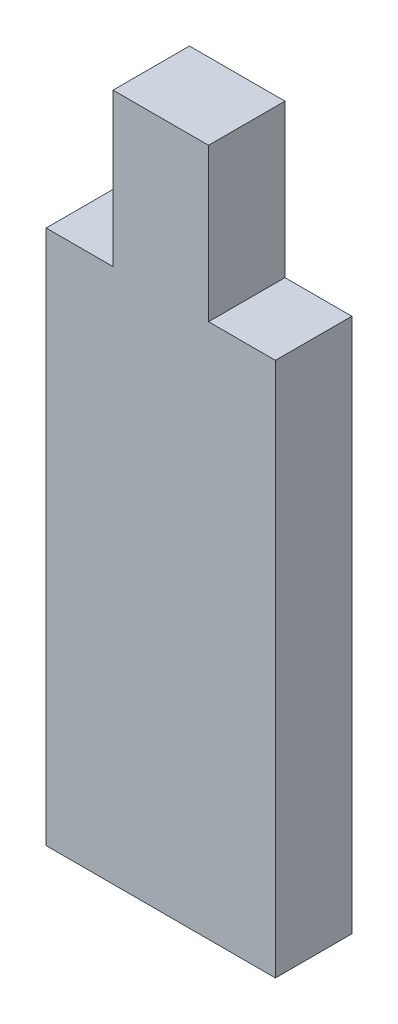
ISO-10303-21;
HEADER;
FILE_DESCRIPTION(('STEP AP214'),'2;1');
FILE_NAME('part.step','',(''),(''),'','','');
FILE_SCHEMA(('AUTOMOTIVE_DESIGN { 1 0 10303 214 1 1 1 1 }'));
ENDSEC;
DATA;
#1=APPLICATION_CONTEXT('core data for automotive mechanical design processes');
#2=APPLICATION_PROTOCOL_DEFINITION('international standard','automotive_design',2000,#1);
#3=PRODUCT_CONTEXT('',#1,'mechanical');
#4=PRODUCT('Part','Part','',(#3));
#5=PRODUCT_RELATED_PRODUCT_CATEGORY('part','',(#4));
#6=PRODUCT_DEFINITION_FORMATION('','',#4);
#7=PRODUCT_DEFINITION_CONTEXT('part definition',#1,'design');
#8=PRODUCT_DEFINITION('design','',#6,#7);
#9=PRODUCT_DEFINITION_SHAPE('','',#8);
#10=(LENGTH_UNIT() NAMED_UNIT(*) SI_UNIT(.MILLI.,.METRE.));
#11=(NAMED_UNIT(*) PLANE_ANGLE_UNIT() SI_UNIT($,.RADIAN.));
#12=(NAMED_UNIT(*) SI_UNIT($,.STERADIAN.) SOLID_ANGLE_UNIT());
#13=UNCERTAINTY_MEASURE_WITH_UNIT(LENGTH_MEASURE(1.E-05),#10,'distance_accuracy_value','');
#14=(GEOMETRIC_REPRESENTATION_CONTEXT(3) GLOBAL_UNCERTAINTY_ASSIGNED_CONTEXT((#13)) GLOBAL_UNIT_ASSIGNED_CONTEXT((#10,
#11,#12)) REPRESENTATION_CONTEXT('',''));
#15=CARTESIAN_POINT('',(0.,0.,0.));
#16=DIRECTION('',(0.,0.,1.));
#17=DIRECTION('',(1.,0.,0.));
#18=AXIS2_PLACEMENT_3D('',#15,#16,#17);
#19=CARTESIAN_POINT('',(12.,0.,4.));
#20=DIRECTION('',(0.,1.,0.));
#21=DIRECTION('',(0.,0.,1.));
#22=AXIS2_PLACEMENT_3D('',#19,#20,#21);
#23=PLANE('',#22);
#24=DIRECTION('',(1.,0.,0.));
#25=VECTOR('',#24,1.);
#26=CARTESIAN_POINT('',(12.,0.,0.));
#27=LINE('',#26,#25);
#28=CARTESIAN_POINT('',(0.,0.,0.));
#29=VERTEX_POINT('',#28);
#30=CARTESIAN_POINT('',(12.,0.,0.));
#31=VERTEX_POINT('',#30);
#32=EDGE_CURVE('E131',#29,#31,#27,.T.);
#33=ORIENTED_EDGE('',*,*,#32,.T.);
#34=DIRECTION('',(0.,0.,-1.));
#35=VECTOR('',#34,1.);
#36=CARTESIAN_POINT('',(12.,0.,4.));
#37=LINE('',#36,#35);
#38=CARTESIAN_POINT('',(12.,0.,4.));
#39=VERTEX_POINT('',#38);
#40=EDGE_CURVE('E11',#39,#31,#37,.T.);
#41=ORIENTED_EDGE('',*,*,#40,.F.);
#42=DIRECTION('',(1.,0.,0.));
#43=VECTOR('',#42,1.);
#44=CARTESIAN_POINT('',(12.,0.,4.));
#45=LINE('',#44,#43);
#46=CARTESIAN_POINT('',(0.,0.,4.));
#47=VERTEX_POINT('',#46);
#48=EDGE_CURVE('E145',#47,#39,#45,.T.);
#49=ORIENTED_EDGE('',*,*,#48,.F.);
#50=DIRECTION('',(0.,0.,-1.));
#51=VECTOR('',#50,1.);
#52=CARTESIAN_POINT('',(0.,0.,4.));
#53=LINE('',#52,#51);
#54=EDGE_CURVE('E127',#47,#29,#53,.T.);
#55=ORIENTED_EDGE('',*,*,#54,.T.);
#56=EDGE_LOOP('',(#33,#41,#49,#55));
#57=FACE_BOUND('',#56,.T.);
#58=ADVANCED_FACE('F35',(#57),#23,.F.);
#59=CARTESIAN_POINT('',(12.,28.,4.));
#60=DIRECTION('',(-1.,0.,0.));
#61=DIRECTION('',(0.,-1.,0.));
#62=AXIS2_PLACEMENT_3D('',#59,#60,#61);
#63=PLANE('',#62);
#64=DIRECTION('',(0.,1.,0.));
#65=VECTOR('',#64,1.);
#66=CARTESIAN_POINT('',(12.,28.,0.));
#67=LINE('',#66,#65);
#68=CARTESIAN_POINT('',(12.,28.,0.));
#69=VERTEX_POINT('',#68);
#70=EDGE_CURVE('E134',#31,#69,#67,.T.);
#71=ORIENTED_EDGE('',*,*,#70,.T.);
#72=DIRECTION('',(0.,0.,-1.));
#73=VECTOR('',#72,1.);
#74=CARTESIAN_POINT('',(12.,28.,4.));
#75=LINE('',#74,#73);
#76=CARTESIAN_POINT('',(12.,28.,4.));
#77=VERTEX_POINT('',#76);
#78=EDGE_CURVE('E43',#77,#69,#75,.T.);
#79=ORIENTED_EDGE('',*,*,#78,.F.);
#80=DIRECTION('',(0.,1.,0.));
#81=VECTOR('',#80,1.);
#82=CARTESIAN_POINT('',(12.,28.,4.));
#83=LINE('',#82,#81);
#84=EDGE_CURVE('E94',#39,#77,#83,.T.);
#85=ORIENTED_EDGE('',*,*,#84,.F.);
#86=ORIENTED_EDGE('',*,*,#40,.T.);
#87=EDGE_LOOP('',(#71,#79,#85,#86));
#88=FACE_BOUND('',#87,.T.);
#89=ADVANCED_FACE('F180',(#88),#63,.F.);
#90=CARTESIAN_POINT('',(8.5,28.,4.));
#91=DIRECTION('',(0.,-1.,0.));
#92=DIRECTION('',(0.,0.,-1.));
#93=AXIS2_PLACEMENT_3D('',#90,#91,#92);
#94=PLANE('',#93);
#95=DIRECTION('',(-1.,0.,0.));
#96=VECTOR('',#95,1.);
#97=CARTESIAN_POINT('',(8.5,28.,0.));
#98=LINE('',#97,#96);
#99=CARTESIAN_POINT('',(8.5,28.,0.));
#100=VERTEX_POINT('',#99);
#101=EDGE_CURVE('E136',#69,#100,#98,.T.);
#102=ORIENTED_EDGE('',*,*,#101,.T.);
#103=DIRECTION('',(0.,0.,-1.));
#104=VECTOR('',#103,1.);
#105=CARTESIAN_POINT('',(8.5,28.,4.));
#106=LINE('',#105,#104);
#107=CARTESIAN_POINT('',(8.5,28.,4.));
#108=VERTEX_POINT('',#107);
#109=EDGE_CURVE('E152',#108,#100,#106,.T.);
#110=ORIENTED_EDGE('',*,*,#109,.F.);
#111=DIRECTION('',(-1.,0.,0.));
#112=VECTOR('',#111,1.);
#113=CARTESIAN_POINT('',(8.5,28.,4.));
#114=LINE('',#113,#112);
#115=EDGE_CURVE('E160',#77,#108,#114,.T.);
#116=ORIENTED_EDGE('',*,*,#115,.F.);
#117=ORIENTED_EDGE('',*,*,#78,.T.);
#118=EDGE_LOOP('',(#102,#110,#116,#117));
#119=FACE_BOUND('',#118,.T.);
#120=ADVANCED_FACE('F158',(#119),#94,.F.);
#121=CARTESIAN_POINT('',(8.5,36.,4.));
#122=DIRECTION('',(-1.,0.,0.));
#123=DIRECTION('',(0.,0.,1.));
#124=AXIS2_PLACEMENT_3D('',#121,#122,#123);
#125=PLANE('',#124);
#126=DIRECTION('',(0.,1.,0.));
#127=VECTOR('',#126,1.);
#128=CARTESIAN_POINT('',(8.5,36.,0.));
#129=LINE('',#128,#127);
#130=CARTESIAN_POINT('',(8.5,36.,0.));
#131=VERTEX_POINT('',#130);
#132=EDGE_CURVE('E138',#100,#131,#129,.T.);
#133=ORIENTED_EDGE('',*,*,#132,.T.);
#134=DIRECTION('',(0.,0.,-1.));
#135=VECTOR('',#134,1.);
#136=CARTESIAN_POINT('',(8.5,36.,4.));
#137=LINE('',#136,#135);
#138=CARTESIAN_POINT('',(8.5,36.,4.));
#139=VERTEX_POINT('',#138);
#140=EDGE_CURVE('E149',#139,#131,#137,.T.);
#141=ORIENTED_EDGE('',*,*,#140,.F.);
#142=DIRECTION('',(0.,1.,0.));
#143=VECTOR('',#142,1.);
#144=CARTESIAN_POINT('',(8.5,36.,4.));
#145=LINE('',#144,#143);
#146=EDGE_CURVE('E172',#108,#139,#145,.T.);
#147=ORIENTED_EDGE('',*,*,#146,.F.);
#148=ORIENTED_EDGE('',*,*,#109,.T.);
#149=EDGE_LOOP('',(#133,#141,#147,#148));
#150=FACE_BOUND('',#149,.T.);
#151=ADVANCED_FACE('F168',(#150),#125,.F.);
#152=CARTESIAN_POINT('',(3.5,36.,4.));
#153=DIRECTION('',(0.,-1.,0.));
#154=DIRECTION('',(0.,0.,-1.));
#155=AXIS2_PLACEMENT_3D('',#152,#153,#154);
#156=PLANE('',#155);
#157=DIRECTION('',(-1.,0.,0.));
#158=VECTOR('',#157,1.);
#159=CARTESIAN_POINT('',(3.5,36.,0.));
#160=LINE('',#159,#158);
#161=CARTESIAN_POINT('',(3.5,36.,0.));
#162=VERTEX_POINT('',#161);
#163=EDGE_CURVE('E140',#131,#162,#160,.T.);
#164=ORIENTED_EDGE('',*,*,#163,.T.);
#165=DIRECTION('',(0.,0.,-1.));
#166=VECTOR('',#165,1.);
#167=CARTESIAN_POINT('',(3.5,36.,4.));
#168=LINE('',#167,#166);
#169=CARTESIAN_POINT('',(3.5,36.,4.));
#170=VERTEX_POINT('',#169);
#171=EDGE_CURVE('E122',#170,#162,#168,.T.);
#172=ORIENTED_EDGE('',*,*,#171,.F.);
#173=DIRECTION('',(-1.,0.,0.));
#174=VECTOR('',#173,1.);
#175=CARTESIAN_POINT('',(3.5,36.,4.));
#176=LINE('',#175,#174);
#177=EDGE_CURVE('E113',#139,#170,#176,.T.);
#178=ORIENTED_EDGE('',*,*,#177,.F.);
#179=ORIENTED_EDGE('',*,*,#140,.T.);
#180=EDGE_LOOP('',(#164,#172,#178,#179));
#181=FACE_BOUND('',#180,.T.);
#182=ADVANCED_FACE('F171',(#181),#156,.F.);
#183=CARTESIAN_POINT('',(3.5,28.,4.));
#184=DIRECTION('',(1.,0.,0.));
#185=DIRECTION('',(0.,1.,0.));
#186=AXIS2_PLACEMENT_3D('',#183,#184,#185);
#187=PLANE('',#186);
#188=DIRECTION('',(0.,-1.,0.));
#189=VECTOR('',#188,1.);
#190=CARTESIAN_POINT('',(3.5,28.,0.));
#191=LINE('',#190,#189);
#192=CARTESIAN_POINT('',(3.5,28.,0.));
#193=VERTEX_POINT('',#192);
#194=EDGE_CURVE('E121',#162,#193,#191,.T.);
#195=ORIENTED_EDGE('',*,*,#194,.T.);
#196=DIRECTION('',(0.,0.,-1.));
#197=VECTOR('',#196,1.);
#198=CARTESIAN_POINT('',(3.5,28.,4.));
#199=LINE('',#198,#197);
#200=CARTESIAN_POINT('',(3.5,28.,4.));
#201=VERTEX_POINT('',#200);
#202=EDGE_CURVE('E118',#201,#193,#199,.T.);
#203=ORIENTED_EDGE('',*,*,#202,.F.);
#204=DIRECTION('',(0.,-1.,0.));
#205=VECTOR('',#204,1.);
#206=CARTESIAN_POINT('',(3.5,28.,4.));
#207=LINE('',#206,#205);
#208=EDGE_CURVE('E107',#170,#201,#207,.T.);
#209=ORIENTED_EDGE('',*,*,#208,.F.);
#210=ORIENTED_EDGE('',*,*,#171,.T.);
#211=EDGE_LOOP('',(#195,#203,#209,#210));
#212=FACE_BOUND('',#211,.T.);
#213=ADVANCED_FACE('F119',(#212),#187,.F.);
#214=CARTESIAN_POINT('',(0.,28.,4.));
#215=DIRECTION('',(0.,-1.,0.));
#216=DIRECTION('',(0.,0.,-1.));
#217=AXIS2_PLACEMENT_3D('',#214,#215,#216);
#218=PLANE('',#217);
#219=DIRECTION('',(-1.,0.,0.));
#220=VECTOR('',#219,1.);
#221=CARTESIAN_POINT('',(0.,28.,0.));
#222=LINE('',#221,#220);
#223=CARTESIAN_POINT('',(0.,28.,0.));
#224=VERTEX_POINT('',#223);
#225=EDGE_CURVE('E80',#193,#224,#222,.T.);
#226=ORIENTED_EDGE('',*,*,#225,.T.);
#227=DIRECTION('',(0.,0.,-1.));
#228=VECTOR('',#227,1.);
#229=CARTESIAN_POINT('',(0.,28.,4.));
#230=LINE('',#229,#228);
#231=CARTESIAN_POINT('',(0.,28.,4.));
#232=VERTEX_POINT('',#231);
#233=EDGE_CURVE('E123',#232,#224,#230,.T.);
#234=ORIENTED_EDGE('',*,*,#233,.F.);
#235=DIRECTION('',(-1.,0.,0.));
#236=VECTOR('',#235,1.);
#237=CARTESIAN_POINT('',(0.,28.,4.));
#238=LINE('',#237,#236);
#239=EDGE_CURVE('E111',#201,#232,#238,.T.);
#240=ORIENTED_EDGE('',*,*,#239,.F.);
#241=ORIENTED_EDGE('',*,*,#202,.T.);
#242=EDGE_LOOP('',(#226,#234,#240,#241));
#243=FACE_BOUND('',#242,.T.);
#244=ADVANCED_FACE('F125',(#243),#218,.F.);
#245=CARTESIAN_POINT('',(0.,0.,4.));
#246=DIRECTION('',(1.,0.,0.));
#247=DIRECTION('',(0.,0.,-1.));
#248=AXIS2_PLACEMENT_3D('',#245,#246,#247);
#249=PLANE('',#248);
#250=DIRECTION('',(0.,-1.,0.));
#251=VECTOR('',#250,1.);
#252=CARTESIAN_POINT('',(0.,0.,0.));
#253=LINE('',#252,#251);
#254=EDGE_CURVE('E86',#224,#29,#253,.T.);
#255=ORIENTED_EDGE('',*,*,#254,.T.);
#256=ORIENTED_EDGE('',*,*,#54,.F.);
#257=DIRECTION('',(0.,-1.,0.));
#258=VECTOR('',#257,1.);
#259=CARTESIAN_POINT('',(0.,0.,4.));
#260=LINE('',#259,#258);
#261=EDGE_CURVE('E51',#232,#47,#260,.T.);
#262=ORIENTED_EDGE('',*,*,#261,.F.);
#263=ORIENTED_EDGE('',*,*,#233,.T.);
#264=EDGE_LOOP('',(#255,#256,#262,#263));
#265=FACE_BOUND('',#264,.T.);
#266=ADVANCED_FACE('F196',(#265),#249,.F.);
#267=CARTESIAN_POINT('',(0.,0.,4.));
#268=DIRECTION('',(0.,0.,-1.));
#269=DIRECTION('',(-1.,0.,0.));
#270=AXIS2_PLACEMENT_3D('',#267,#268,#269);
#271=PLANE('',#270);
#272=ORIENTED_EDGE('',*,*,#48,.T.);
#273=ORIENTED_EDGE('',*,*,#84,.T.);
#274=ORIENTED_EDGE('',*,*,#115,.T.);
#275=ORIENTED_EDGE('',*,*,#146,.T.);
#276=ORIENTED_EDGE('',*,*,#177,.T.);
#277=ORIENTED_EDGE('',*,*,#208,.T.);
#278=ORIENTED_EDGE('',*,*,#239,.T.);
#279=ORIENTED_EDGE('',*,*,#261,.T.);
#280=EDGE_LOOP('',(#272,#273,#274,#275,#276,#277,#278,#279));
#281=FACE_BOUND('',#280,.T.);
#282=ADVANCED_FACE('F109',(#281),#271,.F.);
#283=CARTESIAN_POINT('',(0.,0.,0.));
#284=DIRECTION('',(0.,0.,-1.));
#285=DIRECTION('',(-1.,0.,0.));
#286=AXIS2_PLACEMENT_3D('',#283,#284,#285);
#287=PLANE('',#286);
#288=ORIENTED_EDGE('',*,*,#32,.F.);
#289=ORIENTED_EDGE('',*,*,#254,.F.);
#290=ORIENTED_EDGE('',*,*,#225,.F.);
#291=ORIENTED_EDGE('',*,*,#194,.F.);
#292=ORIENTED_EDGE('',*,*,#163,.F.);
#293=ORIENTED_EDGE('',*,*,#132,.F.);
#294=ORIENTED_EDGE('',*,*,#101,.F.);
#295=ORIENTED_EDGE('',*,*,#70,.F.);
#296=EDGE_LOOP('',(#288,#289,#290,#291,#292,#293,#294,#295));
#297=FACE_BOUND('',#296,.T.);
#298=ADVANCED_FACE('F164',(#297),#287,.T.);
#299=CLOSED_SHELL('',(#58,#89,#120,#151,#182,#213,#244,#266,#282,#298));
#300=MANIFOLD_SOLID_BREP('B2',#299);
#301=ADVANCED_BREP_SHAPE_REPRESENTATION('',(#18,#300),#14);
#302=SHAPE_DEFINITION_REPRESENTATION(#9,#301);
ENDSEC;
END-ISO-10303-21;
